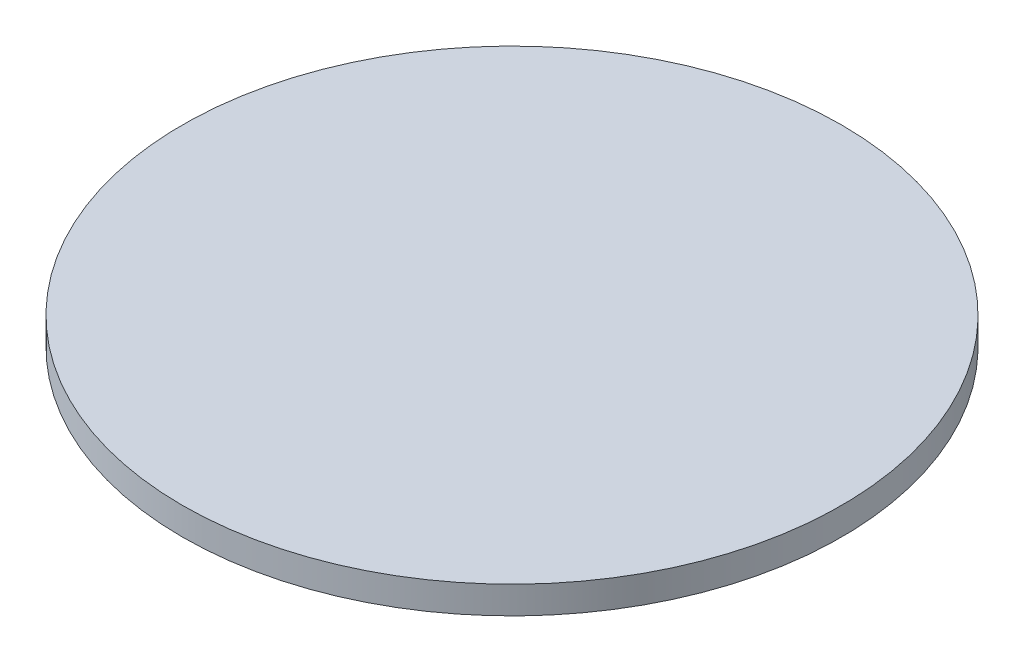
ISO-10303-21;
HEADER;
FILE_DESCRIPTION(('STEP AP214'),'2;1');
FILE_NAME('part.step','',(''),(''),'','','');
FILE_SCHEMA(('AUTOMOTIVE_DESIGN { 1 0 10303 214 1 1 1 1 }'));
ENDSEC;
DATA;
#1=APPLICATION_CONTEXT('core data for automotive mechanical design processes');
#2=APPLICATION_PROTOCOL_DEFINITION('international standard','automotive_design',2000,#1);
#3=PRODUCT_CONTEXT('',#1,'mechanical');
#4=PRODUCT('Part','Part','',(#3));
#5=PRODUCT_RELATED_PRODUCT_CATEGORY('part','',(#4));
#6=PRODUCT_DEFINITION_FORMATION('','',#4);
#7=PRODUCT_DEFINITION_CONTEXT('part definition',#1,'design');
#8=PRODUCT_DEFINITION('design','',#6,#7);
#9=PRODUCT_DEFINITION_SHAPE('','',#8);
#10=(LENGTH_UNIT() NAMED_UNIT(*) SI_UNIT(.MILLI.,.METRE.));
#11=(NAMED_UNIT(*) PLANE_ANGLE_UNIT() SI_UNIT($,.RADIAN.));
#12=(NAMED_UNIT(*) SI_UNIT($,.STERADIAN.) SOLID_ANGLE_UNIT());
#13=UNCERTAINTY_MEASURE_WITH_UNIT(LENGTH_MEASURE(1.E-05),#10,'distance_accuracy_value','');
#14=(GEOMETRIC_REPRESENTATION_CONTEXT(3) GLOBAL_UNCERTAINTY_ASSIGNED_CONTEXT((#13)) GLOBAL_UNIT_ASSIGNED_CONTEXT((#10,
#11,#12)) REPRESENTATION_CONTEXT('',''));
#15=CARTESIAN_POINT('',(0.,0.,0.));
#16=DIRECTION('',(0.,0.,1.));
#17=DIRECTION('',(1.,0.,0.));
#18=AXIS2_PLACEMENT_3D('',#15,#16,#17);
#19=CARTESIAN_POINT('',(0.,1000.,0.));
#20=DIRECTION('',(0.,-1.,0.));
#21=DIRECTION('',(0.,0.,-1.));
#22=AXIS2_PLACEMENT_3D('',#19,#20,#21);
#23=CYLINDRICAL_SURFACE('',#22,12000.);
#24=CARTESIAN_POINT('',(0.,1000.,0.));
#25=DIRECTION('',(0.,1.,0.));
#26=DIRECTION('',(0.,0.,1.));
#27=AXIS2_PLACEMENT_3D('',#24,#25,#26);
#28=CIRCLE('',#27,12000.);
#29=CARTESIAN_POINT('',(0.,1000.,12000.));
#30=VERTEX_POINT('',#29);
#31=EDGE_CURVE('E10',#30,#30,#28,.T.);
#32=ORIENTED_EDGE('',*,*,#31,.F.);
#33=EDGE_LOOP('',(#32));
#34=FACE_BOUND('',#33,.T.);
#35=CARTESIAN_POINT('',(0.,0.,0.));
#36=DIRECTION('',(0.,1.,0.));
#37=DIRECTION('',(0.,0.,1.));
#38=AXIS2_PLACEMENT_3D('',#35,#36,#37);
#39=CIRCLE('',#38,12000.);
#40=CARTESIAN_POINT('',(0.,0.,12000.));
#41=VERTEX_POINT('',#40);
#42=EDGE_CURVE('E46',#41,#41,#39,.T.);
#43=ORIENTED_EDGE('',*,*,#42,.T.);
#44=EDGE_LOOP('',(#43));
#45=FACE_BOUND('',#44,.T.);
#46=ADVANCED_FACE('F43',(#34,#45),#23,.T.);
#47=CARTESIAN_POINT('',(0.,1000.,0.));
#48=DIRECTION('',(0.,1.,0.));
#49=DIRECTION('',(0.,0.,1.));
#50=AXIS2_PLACEMENT_3D('',#47,#48,#49);
#51=PLANE('',#50);
#52=ORIENTED_EDGE('',*,*,#31,.T.);
#53=EDGE_LOOP('',(#52));
#54=FACE_BOUND('',#53,.T.);
#55=ADVANCED_FACE('F60',(#54),#51,.T.);
#56=CARTESIAN_POINT('',(0.,0.,0.));
#57=DIRECTION('',(0.,1.,0.));
#58=DIRECTION('',(0.,0.,1.));
#59=AXIS2_PLACEMENT_3D('',#56,#57,#58);
#60=PLANE('',#59);
#61=ORIENTED_EDGE('',*,*,#42,.F.);
#62=EDGE_LOOP('',(#61));
#63=FACE_BOUND('',#62,.T.);
#64=ADVANCED_FACE('F58',(#63),#60,.F.);
#65=CLOSED_SHELL('',(#46,#55,#64));
#66=MANIFOLD_SOLID_BREP('B2',#65);
#67=ADVANCED_BREP_SHAPE_REPRESENTATION('',(#18,#66),#14);
#68=SHAPE_DEFINITION_REPRESENTATION(#9,#67);
ENDSEC;
END-ISO-10303-21;
